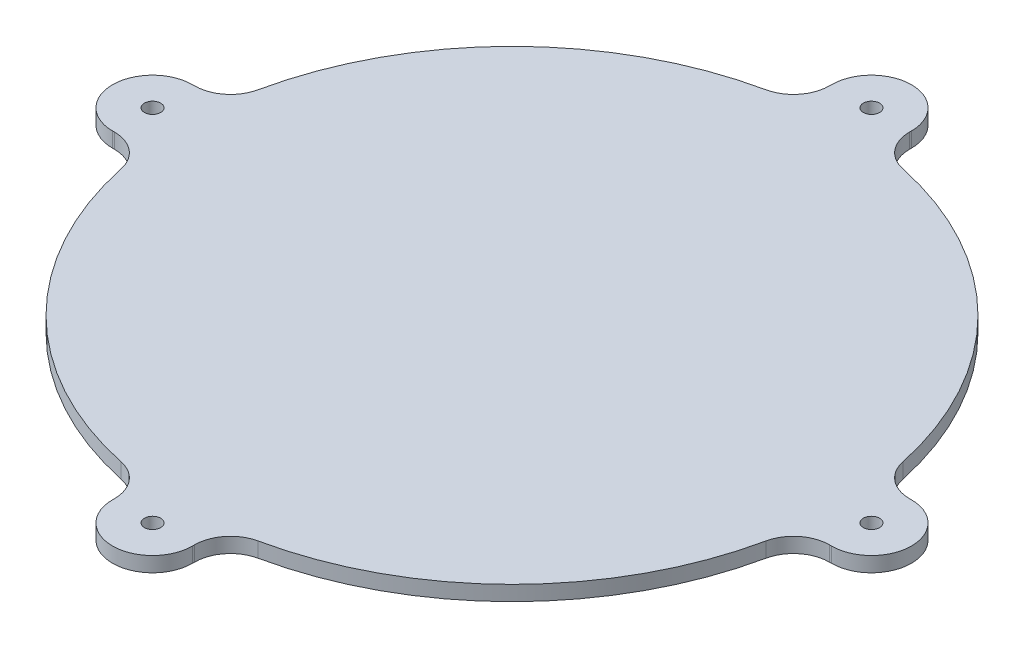
ISO-10303-21;
HEADER;
FILE_DESCRIPTION(('STEP AP214'),'2;1');
FILE_NAME('part.step','',(''),(''),'','','');
FILE_SCHEMA(('AUTOMOTIVE_DESIGN { 1 0 10303 214 1 1 1 1 }'));
ENDSEC;
DATA;
#1=APPLICATION_CONTEXT('core data for automotive mechanical design processes');
#2=APPLICATION_PROTOCOL_DEFINITION('international standard','automotive_design',2000,#1);
#3=PRODUCT_CONTEXT('',#1,'mechanical');
#4=PRODUCT('Part','Part','',(#3));
#5=PRODUCT_RELATED_PRODUCT_CATEGORY('part','',(#4));
#6=PRODUCT_DEFINITION_FORMATION('','',#4);
#7=PRODUCT_DEFINITION_CONTEXT('part definition',#1,'design');
#8=PRODUCT_DEFINITION('design','',#6,#7);
#9=PRODUCT_DEFINITION_SHAPE('','',#8);
#10=(LENGTH_UNIT() NAMED_UNIT(*) SI_UNIT(.MILLI.,.METRE.));
#11=(NAMED_UNIT(*) PLANE_ANGLE_UNIT() SI_UNIT($,.RADIAN.));
#12=(NAMED_UNIT(*) SI_UNIT($,.STERADIAN.) SOLID_ANGLE_UNIT());
#13=UNCERTAINTY_MEASURE_WITH_UNIT(LENGTH_MEASURE(1.E-05),#10,'distance_accuracy_value','');
#14=(GEOMETRIC_REPRESENTATION_CONTEXT(3) GLOBAL_UNCERTAINTY_ASSIGNED_CONTEXT((#13)) GLOBAL_UNIT_ASSIGNED_CONTEXT((#10,
#11,#12)) REPRESENTATION_CONTEXT('',''));
#15=CARTESIAN_POINT('',(0.,0.,0.));
#16=DIRECTION('',(0.,0.,1.));
#17=DIRECTION('',(1.,0.,0.));
#18=AXIS2_PLACEMENT_3D('',#15,#16,#17);
#19=CARTESIAN_POINT('',(-1.06390590781658E-11,3.175,-76.2));
#20=DIRECTION('',(0.,-1.,0.));
#21=DIRECTION('',(0.,0.,-1.));
#22=AXIS2_PLACEMENT_3D('',#19,#20,#21);
#23=PLANE('',#22);
#24=CARTESIAN_POINT('',(-1.06390590781658E-11,3.175,-76.2));
#25=DIRECTION('',(0.,1.,0.));
#26=DIRECTION('',(0.,0.,-1.));
#27=AXIS2_PLACEMENT_3D('',#24,#25,#26);
#28=CIRCLE('',#27,8.4836);
#29=CARTESIAN_POINT('',(8.48359999998936,3.175,-76.2));
#30=VERTEX_POINT('',#29);
#31=CARTESIAN_POINT('',(-8.48360000001064,3.175,-76.2));
#32=VERTEX_POINT('',#31);
#33=EDGE_CURVE('E218',#30,#32,#28,.T.);
#34=ORIENTED_EDGE('',*,*,#33,.T.);
#35=DIRECTION('',(0.,0.,1.));
#36=VECTOR('',#35,1.);
#37=CARTESIAN_POINT('',(-8.48360000001064,3.175,-76.2));
#38=LINE('',#37,#36);
#39=CARTESIAN_POINT('',(-8.48360000001064,3.175,-75.777799961728));
#40=VERTEX_POINT('',#39);
#41=EDGE_CURVE('E205',#32,#40,#38,.T.);
#42=ORIENTED_EDGE('',*,*,#41,.T.);
#43=CARTESIAN_POINT('',(-16.1036000000106,3.175,-75.777799961728));
#44=DIRECTION('',(0.,-1.,0.));
#45=DIRECTION('',(0.,0.,-1.));
#46=AXIS2_PLACEMENT_3D('',#43,#44,#45);
#47=CIRCLE('',#46,7.62);
#48=CARTESIAN_POINT('',(-14.5196393442719,3.175,-68.3242458671318));
#49=VERTEX_POINT('',#48);
#50=EDGE_CURVE('E299',#40,#49,#47,.T.);
#51=ORIENTED_EDGE('',*,*,#50,.T.);
#52=CARTESIAN_POINT('',(0.,3.175,0.));
#53=DIRECTION('',(0.,1.,0.));
#54=DIRECTION('',(0.,0.,1.));
#55=AXIS2_PLACEMENT_3D('',#52,#53,#54);
#56=CIRCLE('',#55,69.85);
#57=CARTESIAN_POINT('',(-68.3242458671358,3.175,-14.5196393442527));
#58=VERTEX_POINT('',#57);
#59=EDGE_CURVE('E217',#49,#58,#56,.T.);
#60=ORIENTED_EDGE('',*,*,#59,.T.);
#61=CARTESIAN_POINT('',(-75.7777999617325,3.175,-16.1035999999893));
#62=DIRECTION('',(0.,-1.,0.));
#63=DIRECTION('',(0.,0.,-1.));
#64=AXIS2_PLACEMENT_3D('',#61,#62,#63);
#65=CIRCLE('',#64,7.62);
#66=CARTESIAN_POINT('',(-75.7777999617325,3.175,-8.48359999998935));
#67=VERTEX_POINT('',#66);
#68=EDGE_CURVE('E335',#58,#67,#65,.T.);
#69=ORIENTED_EDGE('',*,*,#68,.T.);
#70=DIRECTION('',(-1.,0.,0.));
#71=VECTOR('',#70,1.);
#72=CARTESIAN_POINT('',(-76.2,3.175,-8.48359999998935));
#73=LINE('',#72,#71);
#74=CARTESIAN_POINT('',(-76.2,3.175,-8.48359999998935));
#75=VERTEX_POINT('',#74);
#76=EDGE_CURVE('E341',#67,#75,#73,.T.);
#77=ORIENTED_EDGE('',*,*,#76,.T.);
#78=CARTESIAN_POINT('',(-76.2,3.175,1.065305679108E-11));
#79=DIRECTION('',(0.,1.,0.));
#80=DIRECTION('',(0.,0.,-1.));
#81=AXIS2_PLACEMENT_3D('',#78,#79,#80);
#82=CIRCLE('',#81,8.4836);
#83=CARTESIAN_POINT('',(-76.2,3.175,8.48360000001065));
#84=VERTEX_POINT('',#83);
#85=EDGE_CURVE('E352',#75,#84,#82,.T.);
#86=ORIENTED_EDGE('',*,*,#85,.T.);
#87=DIRECTION('',(1.,0.,0.));
#88=VECTOR('',#87,1.);
#89=CARTESIAN_POINT('',(-76.2,3.175,8.48360000001065));
#90=LINE('',#89,#88);
#91=CARTESIAN_POINT('',(-75.777799961728,3.175,8.48360000001065));
#92=VERTEX_POINT('',#91);
#93=EDGE_CURVE('E436',#84,#92,#90,.T.);
#94=ORIENTED_EDGE('',*,*,#93,.T.);
#95=CARTESIAN_POINT('',(-75.777799961728,3.175,16.1036000000107));
#96=DIRECTION('',(0.,-1.,0.));
#97=DIRECTION('',(0.,0.,-1.));
#98=AXIS2_PLACEMENT_3D('',#95,#96,#97);
#99=CIRCLE('',#98,7.62);
#100=CARTESIAN_POINT('',(-68.3242458671318,3.175,14.5196393442719));
#101=VERTEX_POINT('',#100);
#102=EDGE_CURVE('E11',#92,#101,#99,.T.);
#103=ORIENTED_EDGE('',*,*,#102,.T.);
#104=CARTESIAN_POINT('',(0.,3.175,0.));
#105=DIRECTION('',(0.,1.,0.));
#106=DIRECTION('',(0.,0.,1.));
#107=AXIS2_PLACEMENT_3D('',#104,#105,#106);
#108=CIRCLE('',#107,69.85);
#109=CARTESIAN_POINT('',(-14.5196393442527,3.175,68.3242458671359));
#110=VERTEX_POINT('',#109);
#111=EDGE_CURVE('E442',#101,#110,#108,.T.);
#112=ORIENTED_EDGE('',*,*,#111,.T.);
#113=CARTESIAN_POINT('',(-16.1035999999893,3.175,75.7777999617325));
#114=DIRECTION('',(0.,-1.,0.));
#115=DIRECTION('',(0.,0.,-1.));
#116=AXIS2_PLACEMENT_3D('',#113,#114,#115);
#117=CIRCLE('',#116,7.62);
#118=CARTESIAN_POINT('',(-8.48359999998935,3.175,75.7777999617325));
#119=VERTEX_POINT('',#118);
#120=EDGE_CURVE('E329',#110,#119,#117,.T.);
#121=ORIENTED_EDGE('',*,*,#120,.T.);
#122=DIRECTION('',(0.,0.,1.));
#123=VECTOR('',#122,1.);
#124=CARTESIAN_POINT('',(-8.48359999998935,3.175,76.2));
#125=LINE('',#124,#123);
#126=CARTESIAN_POINT('',(-8.48359999998935,3.175,76.2));
#127=VERTEX_POINT('',#126);
#128=EDGE_CURVE('E449',#119,#127,#125,.T.);
#129=ORIENTED_EDGE('',*,*,#128,.T.);
#130=CARTESIAN_POINT('',(1.06483908867753E-11,3.175,76.2));
#131=DIRECTION('',(0.,1.,0.));
#132=DIRECTION('',(0.,0.,-1.));
#133=AXIS2_PLACEMENT_3D('',#130,#131,#132);
#134=CIRCLE('',#133,8.4836);
#135=CARTESIAN_POINT('',(8.48360000001065,3.175,76.2));
#136=VERTEX_POINT('',#135);
#137=EDGE_CURVE('E452',#127,#136,#134,.T.);
#138=ORIENTED_EDGE('',*,*,#137,.T.);
#139=DIRECTION('',(0.,0.,-1.));
#140=VECTOR('',#139,1.);
#141=CARTESIAN_POINT('',(8.48360000001065,3.175,76.2));
#142=LINE('',#141,#140);
#143=CARTESIAN_POINT('',(8.48360000001065,3.175,75.777799961728));
#144=VERTEX_POINT('',#143);
#145=EDGE_CURVE('E455',#136,#144,#142,.T.);
#146=ORIENTED_EDGE('',*,*,#145,.T.);
#147=CARTESIAN_POINT('',(16.1036000000106,3.175,75.777799961728));
#148=DIRECTION('',(0.,-1.,0.));
#149=DIRECTION('',(0.,0.,-1.));
#150=AXIS2_PLACEMENT_3D('',#147,#148,#149);
#151=CIRCLE('',#150,7.62);
#152=CARTESIAN_POINT('',(14.5196393442719,3.175,68.3242458671318));
#153=VERTEX_POINT('',#152);
#154=EDGE_CURVE('E323',#144,#153,#151,.T.);
#155=ORIENTED_EDGE('',*,*,#154,.T.);
#156=CARTESIAN_POINT('',(0.,3.175,0.));
#157=DIRECTION('',(0.,1.,0.));
#158=DIRECTION('',(0.,0.,1.));
#159=AXIS2_PLACEMENT_3D('',#156,#157,#158);
#160=CIRCLE('',#159,69.85);
#161=CARTESIAN_POINT('',(68.3242458671358,3.175,14.5196393442527));
#162=VERTEX_POINT('',#161);
#163=EDGE_CURVE('E459',#153,#162,#160,.T.);
#164=ORIENTED_EDGE('',*,*,#163,.T.);
#165=CARTESIAN_POINT('',(75.7777999617325,3.175,16.1035999999894));
#166=DIRECTION('',(0.,-1.,0.));
#167=DIRECTION('',(0.,0.,-1.));
#168=AXIS2_PLACEMENT_3D('',#165,#166,#167);
#169=CIRCLE('',#168,7.62);
#170=CARTESIAN_POINT('',(75.7777999617325,3.175,8.48359999998936));
#171=VERTEX_POINT('',#170);
#172=EDGE_CURVE('E317',#162,#171,#169,.T.);
#173=ORIENTED_EDGE('',*,*,#172,.T.);
#174=DIRECTION('',(1.,0.,0.));
#175=VECTOR('',#174,1.);
#176=CARTESIAN_POINT('',(76.2,3.175,8.48359999998936));
#177=LINE('',#176,#175);
#178=CARTESIAN_POINT('',(76.2,3.175,8.48359999998936));
#179=VERTEX_POINT('',#178);
#180=EDGE_CURVE('E463',#171,#179,#177,.T.);
#181=ORIENTED_EDGE('',*,*,#180,.T.);
#182=CARTESIAN_POINT('',(76.2,3.175,-1.06437249824705E-11));
#183=DIRECTION('',(0.,1.,0.));
#184=DIRECTION('',(0.,0.,-1.));
#185=AXIS2_PLACEMENT_3D('',#182,#183,#184);
#186=CIRCLE('',#185,8.4836);
#187=CARTESIAN_POINT('',(76.2,3.175,-8.48360000001064));
#188=VERTEX_POINT('',#187);
#189=EDGE_CURVE('E466',#179,#188,#186,.T.);
#190=ORIENTED_EDGE('',*,*,#189,.T.);
#191=DIRECTION('',(-1.,0.,0.));
#192=VECTOR('',#191,1.);
#193=CARTESIAN_POINT('',(76.2,3.175,-8.48360000001064));
#194=LINE('',#193,#192);
#195=CARTESIAN_POINT('',(75.777799961728,3.175,-8.48360000001064));
#196=VERTEX_POINT('',#195);
#197=EDGE_CURVE('E469',#188,#196,#194,.T.);
#198=ORIENTED_EDGE('',*,*,#197,.T.);
#199=CARTESIAN_POINT('',(75.777799961728,3.175,-16.1036000000106));
#200=DIRECTION('',(0.,-1.,0.));
#201=DIRECTION('',(0.,0.,-1.));
#202=AXIS2_PLACEMENT_3D('',#199,#200,#201);
#203=CIRCLE('',#202,7.62);
#204=CARTESIAN_POINT('',(68.3242458671318,3.175,-14.5196393442719));
#205=VERTEX_POINT('',#204);
#206=EDGE_CURVE('E311',#196,#205,#203,.T.);
#207=ORIENTED_EDGE('',*,*,#206,.T.);
#208=CARTESIAN_POINT('',(0.,3.175,0.));
#209=DIRECTION('',(0.,1.,0.));
#210=DIRECTION('',(0.,0.,1.));
#211=AXIS2_PLACEMENT_3D('',#208,#209,#210);
#212=CIRCLE('',#211,69.85);
#213=CARTESIAN_POINT('',(14.5196393442527,3.175,-68.3242458671358));
#214=VERTEX_POINT('',#213);
#215=EDGE_CURVE('E473',#205,#214,#212,.T.);
#216=ORIENTED_EDGE('',*,*,#215,.T.);
#217=CARTESIAN_POINT('',(16.1035999999894,3.175,-75.7777999617325));
#218=DIRECTION('',(0.,-1.,0.));
#219=DIRECTION('',(0.,0.,-1.));
#220=AXIS2_PLACEMENT_3D('',#217,#218,#219);
#221=CIRCLE('',#220,7.62);
#222=CARTESIAN_POINT('',(8.48359999998936,3.175,-75.7777999617325));
#223=VERTEX_POINT('',#222);
#224=EDGE_CURVE('E305',#214,#223,#221,.T.);
#225=ORIENTED_EDGE('',*,*,#224,.T.);
#226=DIRECTION('',(0.,0.,-1.));
#227=VECTOR('',#226,1.);
#228=CARTESIAN_POINT('',(8.48359999998936,3.175,-76.2));
#229=LINE('',#228,#227);
#230=EDGE_CURVE('E223',#223,#30,#229,.T.);
#231=ORIENTED_EDGE('',*,*,#230,.T.);
#232=EDGE_LOOP('',(#34,#42,#51,#60,#69,#77,#86,#94,#103,#112,#121,#129,#138,#146,#155,#164,#173,
#181,#190,#198,#207,#216,#225,#231));
#233=FACE_BOUND('',#232,.T.);
#234=CARTESIAN_POINT('',(-1.06390590781658E-11,3.175,-76.2));
#235=DIRECTION('',(0.,1.,0.));
#236=DIRECTION('',(0.,0.,1.));
#237=AXIS2_PLACEMENT_3D('',#234,#235,#236);
#238=CIRCLE('',#237,1.72720000001017);
#239=CARTESIAN_POINT('',(-1.06390590781658E-11,3.175,-74.4727999999898));
#240=VERTEX_POINT('',#239);
#241=EDGE_CURVE('E479',#240,#240,#238,.T.);
#242=ORIENTED_EDGE('',*,*,#241,.F.);
#243=EDGE_LOOP('',(#242));
#244=FACE_BOUND('',#243,.T.);
#245=CARTESIAN_POINT('',(76.1999999999915,3.175,-1.14130410228708E-12));
#246=DIRECTION('',(0.,1.,0.));
#247=DIRECTION('',(0.,0.,1.));
#248=AXIS2_PLACEMENT_3D('',#245,#246,#247);
#249=CIRCLE('',#248,1.72720000000382);
#250=CARTESIAN_POINT('',(76.1999999999915,3.175,1.72720000000268));
#251=VERTEX_POINT('',#250);
#252=EDGE_CURVE('E488',#251,#251,#249,.T.);
#253=ORIENTED_EDGE('',*,*,#252,.F.);
#254=EDGE_LOOP('',(#253));
#255=FACE_BOUND('',#254,.T.);
#256=CARTESIAN_POINT('',(-7.33882638442284E-12,3.175,76.200000000001));
#257=DIRECTION('',(0.,1.,0.));
#258=DIRECTION('',(0.,0.,1.));
#259=AXIS2_PLACEMENT_3D('',#256,#257,#258);
#260=CIRCLE('',#259,1.72719999999319);
#261=CARTESIAN_POINT('',(-7.33882638442284E-12,3.175,77.9271999999942));
#262=VERTEX_POINT('',#261);
#263=EDGE_CURVE('E496',#262,#262,#260,.T.);
#264=ORIENTED_EDGE('',*,*,#263,.F.);
#265=EDGE_LOOP('',(#264));
#266=FACE_BOUND('',#265,.T.);
#267=CARTESIAN_POINT('',(-76.2000000000095,3.175,2.17759220867485E-12));
#268=DIRECTION('',(0.,1.,0.));
#269=DIRECTION('',(0.,0.,1.));
#270=AXIS2_PLACEMENT_3D('',#267,#268,#269);
#271=CIRCLE('',#270,1.72720000000007);
#272=CARTESIAN_POINT('',(-76.2000000000095,3.175,1.72720000000225));
#273=VERTEX_POINT('',#272);
#274=EDGE_CURVE('E504',#273,#273,#271,.T.);
#275=ORIENTED_EDGE('',*,*,#274,.F.);
#276=EDGE_LOOP('',(#275));
#277=FACE_BOUND('',#276,.T.);
#278=ADVANCED_FACE('F43',(#233,#244,#255,#266,#277),#23,.F.);
#279=CARTESIAN_POINT('',(-1.06390590781658E-11,0.,-76.2));
#280=DIRECTION('',(0.,-1.,0.));
#281=DIRECTION('',(0.,0.,-1.));
#282=AXIS2_PLACEMENT_3D('',#279,#280,#281);
#283=PLANE('',#282);
#284=CARTESIAN_POINT('',(-7.33882638442284E-12,0.,76.200000000001));
#285=DIRECTION('',(0.,1.,0.));
#286=DIRECTION('',(0.,0.,1.));
#287=AXIS2_PLACEMENT_3D('',#284,#285,#286);
#288=CIRCLE('',#287,1.72719999999319);
#289=CARTESIAN_POINT('',(-7.33882638442284E-12,0.,77.9271999999942));
#290=VERTEX_POINT('',#289);
#291=EDGE_CURVE('E500',#290,#290,#288,.T.);
#292=ORIENTED_EDGE('',*,*,#291,.T.);
#293=EDGE_LOOP('',(#292));
#294=FACE_BOUND('',#293,.T.);
#295=CARTESIAN_POINT('',(-1.06390590781658E-11,0.,-76.2));
#296=DIRECTION('',(0.,1.,0.));
#297=DIRECTION('',(0.,0.,1.));
#298=AXIS2_PLACEMENT_3D('',#295,#296,#297);
#299=CIRCLE('',#298,1.72720000001017);
#300=CARTESIAN_POINT('',(-1.06390590781658E-11,0.,-74.4727999999898));
#301=VERTEX_POINT('',#300);
#302=EDGE_CURVE('E482',#301,#301,#299,.T.);
#303=ORIENTED_EDGE('',*,*,#302,.T.);
#304=EDGE_LOOP('',(#303));
#305=FACE_BOUND('',#304,.T.);
#306=CARTESIAN_POINT('',(-1.06390590781658E-11,0.,-76.2));
#307=DIRECTION('',(0.,1.,0.));
#308=DIRECTION('',(0.,0.,-1.));
#309=AXIS2_PLACEMENT_3D('',#306,#307,#308);
#310=CIRCLE('',#309,8.4836);
#311=CARTESIAN_POINT('',(8.48359999998936,0.,-76.2));
#312=VERTEX_POINT('',#311);
#313=CARTESIAN_POINT('',(-8.48360000001064,0.,-76.2));
#314=VERTEX_POINT('',#313);
#315=EDGE_CURVE('E232',#312,#314,#310,.T.);
#316=ORIENTED_EDGE('',*,*,#315,.F.);
#317=DIRECTION('',(0.,0.,-1.));
#318=VECTOR('',#317,1.);
#319=CARTESIAN_POINT('',(8.48359999998936,0.,-76.2));
#320=LINE('',#319,#318);
#321=CARTESIAN_POINT('',(8.48359999998936,0.,-75.7777999617325));
#322=VERTEX_POINT('',#321);
#323=EDGE_CURVE('E228',#322,#312,#320,.T.);
#324=ORIENTED_EDGE('',*,*,#323,.F.);
#325=CARTESIAN_POINT('',(16.1035999999894,0.,-75.7777999617325));
#326=DIRECTION('',(0.,-1.,0.));
#327=DIRECTION('',(0.,0.,-1.));
#328=AXIS2_PLACEMENT_3D('',#325,#326,#327);
#329=CIRCLE('',#328,7.62);
#330=CARTESIAN_POINT('',(14.5196393442527,0.,-68.3242458671358));
#331=VERTEX_POINT('',#330);
#332=EDGE_CURVE('E302',#322,#331,#329,.F.);
#333=ORIENTED_EDGE('',*,*,#332,.T.);
#334=CARTESIAN_POINT('',(0.,0.,0.));
#335=DIRECTION('',(0.,1.,0.));
#336=DIRECTION('',(0.,0.,1.));
#337=AXIS2_PLACEMENT_3D('',#334,#335,#336);
#338=CIRCLE('',#337,69.85);
#339=CARTESIAN_POINT('',(68.3242458671318,0.,-14.5196393442719));
#340=VERTEX_POINT('',#339);
#341=EDGE_CURVE('E408',#340,#331,#338,.T.);
#342=ORIENTED_EDGE('',*,*,#341,.F.);
#343=CARTESIAN_POINT('',(75.777799961728,0.,-16.1036000000106));
#344=DIRECTION('',(0.,-1.,0.));
#345=DIRECTION('',(0.,0.,-1.));
#346=AXIS2_PLACEMENT_3D('',#343,#344,#345);
#347=CIRCLE('',#346,7.62);
#348=CARTESIAN_POINT('',(75.777799961728,0.,-8.48360000001064));
#349=VERTEX_POINT('',#348);
#350=EDGE_CURVE('E308',#340,#349,#347,.F.);
#351=ORIENTED_EDGE('',*,*,#350,.T.);
#352=DIRECTION('',(-1.,0.,0.));
#353=VECTOR('',#352,1.);
#354=CARTESIAN_POINT('',(76.2,0.,-8.48360000001064));
#355=LINE('',#354,#353);
#356=CARTESIAN_POINT('',(76.2,0.,-8.48360000001064));
#357=VERTEX_POINT('',#356);
#358=EDGE_CURVE('E404',#357,#349,#355,.T.);
#359=ORIENTED_EDGE('',*,*,#358,.F.);
#360=CARTESIAN_POINT('',(76.2,0.,-1.06437249824705E-11));
#361=DIRECTION('',(0.,1.,0.));
#362=DIRECTION('',(0.,0.,-1.));
#363=AXIS2_PLACEMENT_3D('',#360,#361,#362);
#364=CIRCLE('',#363,8.4836);
#365=CARTESIAN_POINT('',(76.2,0.,8.48359999998936));
#366=VERTEX_POINT('',#365);
#367=EDGE_CURVE('E401',#366,#357,#364,.T.);
#368=ORIENTED_EDGE('',*,*,#367,.F.);
#369=DIRECTION('',(1.,0.,0.));
#370=VECTOR('',#369,1.);
#371=CARTESIAN_POINT('',(76.2,0.,8.48359999998936));
#372=LINE('',#371,#370);
#373=CARTESIAN_POINT('',(75.7777999617325,0.,8.48359999998936));
#374=VERTEX_POINT('',#373);
#375=EDGE_CURVE('E398',#374,#366,#372,.T.);
#376=ORIENTED_EDGE('',*,*,#375,.F.);
#377=CARTESIAN_POINT('',(75.7777999617325,0.,16.1035999999894));
#378=DIRECTION('',(0.,-1.,0.));
#379=DIRECTION('',(0.,0.,-1.));
#380=AXIS2_PLACEMENT_3D('',#377,#378,#379);
#381=CIRCLE('',#380,7.62);
#382=CARTESIAN_POINT('',(68.3242458671358,0.,14.5196393442527));
#383=VERTEX_POINT('',#382);
#384=EDGE_CURVE('E314',#374,#383,#381,.F.);
#385=ORIENTED_EDGE('',*,*,#384,.T.);
#386=CARTESIAN_POINT('',(0.,0.,0.));
#387=DIRECTION('',(0.,1.,0.));
#388=DIRECTION('',(0.,0.,1.));
#389=AXIS2_PLACEMENT_3D('',#386,#387,#388);
#390=CIRCLE('',#389,69.85);
#391=CARTESIAN_POINT('',(14.5196393442719,0.,68.3242458671318));
#392=VERTEX_POINT('',#391);
#393=EDGE_CURVE('E394',#392,#383,#390,.T.);
#394=ORIENTED_EDGE('',*,*,#393,.F.);
#395=CARTESIAN_POINT('',(16.1036000000106,0.,75.777799961728));
#396=DIRECTION('',(0.,-1.,0.));
#397=DIRECTION('',(0.,0.,-1.));
#398=AXIS2_PLACEMENT_3D('',#395,#396,#397);
#399=CIRCLE('',#398,7.62);
#400=CARTESIAN_POINT('',(8.48360000001065,0.,75.777799961728));
#401=VERTEX_POINT('',#400);
#402=EDGE_CURVE('E320',#392,#401,#399,.F.);
#403=ORIENTED_EDGE('',*,*,#402,.T.);
#404=DIRECTION('',(0.,0.,-1.));
#405=VECTOR('',#404,1.);
#406=CARTESIAN_POINT('',(8.48360000001065,0.,76.2));
#407=LINE('',#406,#405);
#408=CARTESIAN_POINT('',(8.48360000001065,0.,76.2));
#409=VERTEX_POINT('',#408);
#410=EDGE_CURVE('E390',#409,#401,#407,.T.);
#411=ORIENTED_EDGE('',*,*,#410,.F.);
#412=CARTESIAN_POINT('',(1.06483908867753E-11,0.,76.2));
#413=DIRECTION('',(0.,1.,0.));
#414=DIRECTION('',(0.,0.,-1.));
#415=AXIS2_PLACEMENT_3D('',#412,#413,#414);
#416=CIRCLE('',#415,8.4836);
#417=CARTESIAN_POINT('',(-8.48359999998935,0.,76.2));
#418=VERTEX_POINT('',#417);
#419=EDGE_CURVE('E387',#418,#409,#416,.T.);
#420=ORIENTED_EDGE('',*,*,#419,.F.);
#421=DIRECTION('',(0.,0.,1.));
#422=VECTOR('',#421,1.);
#423=CARTESIAN_POINT('',(-8.48359999998935,0.,76.2));
#424=LINE('',#423,#422);
#425=CARTESIAN_POINT('',(-8.48359999998935,0.,75.7777999617325));
#426=VERTEX_POINT('',#425);
#427=EDGE_CURVE('E384',#426,#418,#424,.T.);
#428=ORIENTED_EDGE('',*,*,#427,.F.);
#429=CARTESIAN_POINT('',(-16.1035999999893,0.,75.7777999617325));
#430=DIRECTION('',(0.,-1.,0.));
#431=DIRECTION('',(0.,0.,-1.));
#432=AXIS2_PLACEMENT_3D('',#429,#430,#431);
#433=CIRCLE('',#432,7.62);
#434=CARTESIAN_POINT('',(-14.5196393442527,0.,68.3242458671359));
#435=VERTEX_POINT('',#434);
#436=EDGE_CURVE('E326',#426,#435,#433,.F.);
#437=ORIENTED_EDGE('',*,*,#436,.T.);
#438=CARTESIAN_POINT('',(0.,0.,0.));
#439=DIRECTION('',(0.,1.,0.));
#440=DIRECTION('',(0.,0.,1.));
#441=AXIS2_PLACEMENT_3D('',#438,#439,#440);
#442=CIRCLE('',#441,69.85);
#443=CARTESIAN_POINT('',(-68.3242458671318,0.,14.5196393442719));
#444=VERTEX_POINT('',#443);
#445=EDGE_CURVE('E380',#444,#435,#442,.T.);
#446=ORIENTED_EDGE('',*,*,#445,.F.);
#447=CARTESIAN_POINT('',(-75.777799961728,0.,16.1036000000107));
#448=DIRECTION('',(0.,-1.,0.));
#449=DIRECTION('',(0.,0.,-1.));
#450=AXIS2_PLACEMENT_3D('',#447,#448,#449);
#451=CIRCLE('',#450,7.62);
#452=CARTESIAN_POINT('',(-75.777799961728,0.,8.48360000001065));
#453=VERTEX_POINT('',#452);
#454=EDGE_CURVE('E52',#444,#453,#451,.F.);
#455=ORIENTED_EDGE('',*,*,#454,.T.);
#456=DIRECTION('',(1.,0.,0.));
#457=VECTOR('',#456,1.);
#458=CARTESIAN_POINT('',(-76.2,0.,8.48360000001065));
#459=LINE('',#458,#457);
#460=CARTESIAN_POINT('',(-76.2,0.,8.48360000001065));
#461=VERTEX_POINT('',#460);
#462=EDGE_CURVE('E377',#461,#453,#459,.T.);
#463=ORIENTED_EDGE('',*,*,#462,.F.);
#464=CARTESIAN_POINT('',(-76.2,0.,1.065305679108E-11));
#465=DIRECTION('',(0.,1.,0.));
#466=DIRECTION('',(0.,0.,-1.));
#467=AXIS2_PLACEMENT_3D('',#464,#465,#466);
#468=CIRCLE('',#467,8.4836);
#469=CARTESIAN_POINT('',(-76.2,0.,-8.48359999998935));
#470=VERTEX_POINT('',#469);
#471=EDGE_CURVE('E370',#470,#461,#468,.T.);
#472=ORIENTED_EDGE('',*,*,#471,.F.);
#473=DIRECTION('',(-1.,0.,0.));
#474=VECTOR('',#473,1.);
#475=CARTESIAN_POINT('',(-76.2,0.,-8.48359999998935));
#476=LINE('',#475,#474);
#477=CARTESIAN_POINT('',(-75.7777999617325,0.,-8.48359999998935));
#478=VERTEX_POINT('',#477);
#479=EDGE_CURVE('E361',#478,#470,#476,.T.);
#480=ORIENTED_EDGE('',*,*,#479,.F.);
#481=CARTESIAN_POINT('',(-75.7777999617325,0.,-16.1035999999893));
#482=DIRECTION('',(0.,-1.,0.));
#483=DIRECTION('',(0.,0.,-1.));
#484=AXIS2_PLACEMENT_3D('',#481,#482,#483);
#485=CIRCLE('',#484,7.62);
#486=CARTESIAN_POINT('',(-68.3242458671358,0.,-14.5196393442527));
#487=VERTEX_POINT('',#486);
#488=EDGE_CURVE('E332',#478,#487,#485,.F.);
#489=ORIENTED_EDGE('',*,*,#488,.T.);
#490=CARTESIAN_POINT('',(0.,0.,0.));
#491=DIRECTION('',(0.,1.,0.));
#492=DIRECTION('',(0.,0.,1.));
#493=AXIS2_PLACEMENT_3D('',#490,#491,#492);
#494=CIRCLE('',#493,69.85);
#495=CARTESIAN_POINT('',(-14.5196393442719,0.,-68.3242458671318));
#496=VERTEX_POINT('',#495);
#497=EDGE_CURVE('E359',#496,#487,#494,.T.);
#498=ORIENTED_EDGE('',*,*,#497,.F.);
#499=CARTESIAN_POINT('',(-16.1036000000106,0.,-75.777799961728));
#500=DIRECTION('',(0.,-1.,0.));
#501=DIRECTION('',(0.,0.,-1.));
#502=AXIS2_PLACEMENT_3D('',#499,#500,#501);
#503=CIRCLE('',#502,7.62);
#504=CARTESIAN_POINT('',(-8.48360000001064,0.,-75.777799961728));
#505=VERTEX_POINT('',#504);
#506=EDGE_CURVE('E296',#496,#505,#503,.F.);
#507=ORIENTED_EDGE('',*,*,#506,.T.);
#508=DIRECTION('',(0.,0.,1.));
#509=VECTOR('',#508,1.);
#510=CARTESIAN_POINT('',(-8.48360000001064,0.,-76.2));
#511=LINE('',#510,#509);
#512=EDGE_CURVE('E366',#314,#505,#511,.T.);
#513=ORIENTED_EDGE('',*,*,#512,.F.);
#514=EDGE_LOOP('',(#316,#324,#333,#342,#351,#359,#368,#376,#385,#394,#403,#411,#420,#428,#437,
#446,#455,#463,#472,#480,#489,#498,#507,#513));
#515=FACE_BOUND('',#514,.T.);
#516=CARTESIAN_POINT('',(76.1999999999915,0.,-1.14130410228708E-12));
#517=DIRECTION('',(0.,1.,0.));
#518=DIRECTION('',(0.,0.,1.));
#519=AXIS2_PLACEMENT_3D('',#516,#517,#518);
#520=CIRCLE('',#519,1.72720000000382);
#521=CARTESIAN_POINT('',(76.1999999999915,0.,1.72720000000268));
#522=VERTEX_POINT('',#521);
#523=EDGE_CURVE('E491',#522,#522,#520,.T.);
#524=ORIENTED_EDGE('',*,*,#523,.T.);
#525=EDGE_LOOP('',(#524));
#526=FACE_BOUND('',#525,.T.);
#527=CARTESIAN_POINT('',(-76.2000000000095,0.,2.17759220867485E-12));
#528=DIRECTION('',(0.,1.,0.));
#529=DIRECTION('',(0.,0.,1.));
#530=AXIS2_PLACEMENT_3D('',#527,#528,#529);
#531=CIRCLE('',#530,1.72720000000007);
#532=CARTESIAN_POINT('',(-76.2000000000095,0.,1.72720000000225));
#533=VERTEX_POINT('',#532);
#534=EDGE_CURVE('E508',#533,#533,#531,.T.);
#535=ORIENTED_EDGE('',*,*,#534,.T.);
#536=EDGE_LOOP('',(#535));
#537=FACE_BOUND('',#536,.T.);
#538=ADVANCED_FACE('F357',(#294,#305,#515,#526,#537),#283,.T.);
#539=CARTESIAN_POINT('',(-1.06390590781658E-11,3.175,-76.2));
#540=DIRECTION('',(0.,-1.,0.));
#541=DIRECTION('',(0.,0.,-1.));
#542=AXIS2_PLACEMENT_3D('',#539,#540,#541);
#543=CYLINDRICAL_SURFACE('',#542,8.4836);
#544=ORIENTED_EDGE('',*,*,#315,.T.);
#545=DIRECTION('',(0.,-1.,0.));
#546=VECTOR('',#545,1.);
#547=CARTESIAN_POINT('',(-8.48360000001064,3.175,-76.2));
#548=LINE('',#547,#546);
#549=EDGE_CURVE('E210',#32,#314,#548,.T.);
#550=ORIENTED_EDGE('',*,*,#549,.F.);
#551=ORIENTED_EDGE('',*,*,#33,.F.);
#552=DIRECTION('',(0.,-1.,0.));
#553=VECTOR('',#552,1.);
#554=CARTESIAN_POINT('',(8.48359999998936,3.175,-76.2));
#555=LINE('',#554,#553);
#556=EDGE_CURVE('E414',#30,#312,#555,.T.);
#557=ORIENTED_EDGE('',*,*,#556,.T.);
#558=EDGE_LOOP('',(#544,#550,#551,#557));
#559=FACE_BOUND('',#558,.T.);
#560=ADVANCED_FACE('F230',(#559),#543,.T.);
#561=CARTESIAN_POINT('',(-8.48360000001064,3.175,-76.2));
#562=DIRECTION('',(1.,0.,0.));
#563=DIRECTION('',(0.,0.,-1.));
#564=AXIS2_PLACEMENT_3D('',#561,#562,#563);
#565=PLANE('',#564);
#566=ORIENTED_EDGE('',*,*,#512,.T.);
#567=DIRECTION('',(0.,1.,0.));
#568=VECTOR('',#567,1.);
#569=CARTESIAN_POINT('',(-8.48360000001064,3.175,-75.777799961728));
#570=LINE('',#569,#568);
#571=EDGE_CURVE('E213',#505,#40,#570,.T.);
#572=ORIENTED_EDGE('',*,*,#571,.T.);
#573=ORIENTED_EDGE('',*,*,#41,.F.);
#574=ORIENTED_EDGE('',*,*,#549,.T.);
#575=EDGE_LOOP('',(#566,#572,#573,#574));
#576=FACE_BOUND('',#575,.T.);
#577=ADVANCED_FACE('F208',(#576),#565,.F.);
#578=CARTESIAN_POINT('',(0.,3.175,0.));
#579=DIRECTION('',(0.,-1.,0.));
#580=DIRECTION('',(0.,0.,-1.));
#581=AXIS2_PLACEMENT_3D('',#578,#579,#580);
#582=CYLINDRICAL_SURFACE('',#581,69.85);
#583=ORIENTED_EDGE('',*,*,#59,.F.);
#584=DIRECTION('',(0.,-1.,0.));
#585=VECTOR('',#584,1.);
#586=CARTESIAN_POINT('',(-14.5196393442719,3.175,-68.3242458671318));
#587=LINE('',#586,#585);
#588=EDGE_CURVE('E239',#49,#496,#587,.T.);
#589=ORIENTED_EDGE('',*,*,#588,.T.);
#590=ORIENTED_EDGE('',*,*,#497,.T.);
#591=DIRECTION('',(0.,-1.,0.));
#592=VECTOR('',#591,1.);
#593=CARTESIAN_POINT('',(-68.3242458671358,3.175,-14.5196393442527));
#594=LINE('',#593,#592);
#595=EDGE_CURVE('E234',#487,#58,#594,.F.);
#596=ORIENTED_EDGE('',*,*,#595,.T.);
#597=EDGE_LOOP('',(#583,#589,#590,#596));
#598=FACE_BOUND('',#597,.T.);
#599=ADVANCED_FACE('F363',(#598),#582,.T.);
#600=CARTESIAN_POINT('',(-76.2,3.175,-8.48359999998935));
#601=DIRECTION('',(0.,0.,1.));
#602=DIRECTION('',(1.,0.,0.));
#603=AXIS2_PLACEMENT_3D('',#600,#601,#602);
#604=PLANE('',#603);
#605=ORIENTED_EDGE('',*,*,#76,.F.);
#606=DIRECTION('',(0.,1.,0.));
#607=VECTOR('',#606,1.);
#608=CARTESIAN_POINT('',(-75.7777999617325,0.,-8.48359999998935));
#609=LINE('',#608,#607);
#610=EDGE_CURVE('E290',#67,#478,#609,.F.);
#611=ORIENTED_EDGE('',*,*,#610,.T.);
#612=ORIENTED_EDGE('',*,*,#479,.T.);
#613=DIRECTION('',(0.,-1.,0.));
#614=VECTOR('',#613,1.);
#615=CARTESIAN_POINT('',(-76.2,3.175,-8.48359999998935));
#616=LINE('',#615,#614);
#617=EDGE_CURVE('E235',#75,#470,#616,.T.);
#618=ORIENTED_EDGE('',*,*,#617,.F.);
#619=EDGE_LOOP('',(#605,#611,#612,#618));
#620=FACE_BOUND('',#619,.T.);
#621=ADVANCED_FACE('F348',(#620),#604,.F.);
#622=CARTESIAN_POINT('',(-76.2,3.175,1.065305679108E-11));
#623=DIRECTION('',(0.,-1.,0.));
#624=DIRECTION('',(0.,0.,-1.));
#625=AXIS2_PLACEMENT_3D('',#622,#623,#624);
#626=CYLINDRICAL_SURFACE('',#625,8.4836);
#627=ORIENTED_EDGE('',*,*,#471,.T.);
#628=DIRECTION('',(0.,-1.,0.));
#629=VECTOR('',#628,1.);
#630=CARTESIAN_POINT('',(-76.2,3.175,8.48360000001065));
#631=LINE('',#630,#629);
#632=EDGE_CURVE('E242',#84,#461,#631,.T.);
#633=ORIENTED_EDGE('',*,*,#632,.F.);
#634=ORIENTED_EDGE('',*,*,#85,.F.);
#635=ORIENTED_EDGE('',*,*,#617,.T.);
#636=EDGE_LOOP('',(#627,#633,#634,#635));
#637=FACE_BOUND('',#636,.T.);
#638=ADVANCED_FACE('F438',(#637),#626,.T.);
#639=CARTESIAN_POINT('',(-76.2,3.175,8.48360000001065));
#640=DIRECTION('',(0.,0.,-1.));
#641=DIRECTION('',(-1.,0.,0.));
#642=AXIS2_PLACEMENT_3D('',#639,#640,#641);
#643=PLANE('',#642);
#644=ORIENTED_EDGE('',*,*,#462,.T.);
#645=DIRECTION('',(0.,1.,0.));
#646=VECTOR('',#645,1.);
#647=CARTESIAN_POINT('',(-75.777799961728,3.175,8.48360000001065));
#648=LINE('',#647,#646);
#649=EDGE_CURVE('E59',#453,#92,#648,.T.);
#650=ORIENTED_EDGE('',*,*,#649,.T.);
#651=ORIENTED_EDGE('',*,*,#93,.F.);
#652=ORIENTED_EDGE('',*,*,#632,.T.);
#653=EDGE_LOOP('',(#644,#650,#651,#652));
#654=FACE_BOUND('',#653,.T.);
#655=ADVANCED_FACE('F435',(#654),#643,.F.);
#656=CARTESIAN_POINT('',(0.,3.175,0.));
#657=DIRECTION('',(0.,-1.,0.));
#658=DIRECTION('',(0.,0.,-1.));
#659=AXIS2_PLACEMENT_3D('',#656,#657,#658);
#660=CYLINDRICAL_SURFACE('',#659,69.85);
#661=ORIENTED_EDGE('',*,*,#445,.T.);
#662=DIRECTION('',(0.,-1.,0.));
#663=VECTOR('',#662,1.);
#664=CARTESIAN_POINT('',(-14.5196393442527,3.175,68.3242458671359));
#665=LINE('',#664,#663);
#666=EDGE_CURVE('E287',#435,#110,#665,.F.);
#667=ORIENTED_EDGE('',*,*,#666,.T.);
#668=ORIENTED_EDGE('',*,*,#111,.F.);
#669=DIRECTION('',(0.,-1.,0.));
#670=VECTOR('',#669,1.);
#671=CARTESIAN_POINT('',(-68.3242458671318,3.175,14.5196393442719));
#672=LINE('',#671,#670);
#673=EDGE_CURVE('E283',#101,#444,#672,.T.);
#674=ORIENTED_EDGE('',*,*,#673,.T.);
#675=EDGE_LOOP('',(#661,#667,#668,#674));
#676=FACE_BOUND('',#675,.T.);
#677=ADVANCED_FACE('F565',(#676),#660,.T.);
#678=CARTESIAN_POINT('',(-8.48359999998935,3.175,76.2));
#679=DIRECTION('',(1.,0.,0.));
#680=DIRECTION('',(0.,0.,-1.));
#681=AXIS2_PLACEMENT_3D('',#678,#679,#680);
#682=PLANE('',#681);
#683=ORIENTED_EDGE('',*,*,#128,.F.);
#684=DIRECTION('',(0.,1.,0.));
#685=VECTOR('',#684,1.);
#686=CARTESIAN_POINT('',(-8.48359999998935,0.,75.7777999617325));
#687=LINE('',#686,#685);
#688=EDGE_CURVE('E279',#119,#426,#687,.F.);
#689=ORIENTED_EDGE('',*,*,#688,.T.);
#690=ORIENTED_EDGE('',*,*,#427,.T.);
#691=DIRECTION('',(0.,-1.,0.));
#692=VECTOR('',#691,1.);
#693=CARTESIAN_POINT('',(-8.48359999998935,3.175,76.2));
#694=LINE('',#693,#692);
#695=EDGE_CURVE('E429',#127,#418,#694,.T.);
#696=ORIENTED_EDGE('',*,*,#695,.F.);
#697=EDGE_LOOP('',(#683,#689,#690,#696));
#698=FACE_BOUND('',#697,.T.);
#699=ADVANCED_FACE('F561',(#698),#682,.F.);
#700=CARTESIAN_POINT('',(1.06483908867753E-11,3.175,76.2));
#701=DIRECTION('',(0.,-1.,0.));
#702=DIRECTION('',(0.,0.,-1.));
#703=AXIS2_PLACEMENT_3D('',#700,#701,#702);
#704=CYLINDRICAL_SURFACE('',#703,8.4836);
#705=ORIENTED_EDGE('',*,*,#419,.T.);
#706=DIRECTION('',(0.,-1.,0.));
#707=VECTOR('',#706,1.);
#708=CARTESIAN_POINT('',(8.48360000001065,3.175,76.2));
#709=LINE('',#708,#707);
#710=EDGE_CURVE('E425',#136,#409,#709,.T.);
#711=ORIENTED_EDGE('',*,*,#710,.F.);
#712=ORIENTED_EDGE('',*,*,#137,.F.);
#713=ORIENTED_EDGE('',*,*,#695,.T.);
#714=EDGE_LOOP('',(#705,#711,#712,#713));
#715=FACE_BOUND('',#714,.T.);
#716=ADVANCED_FACE('F557',(#715),#704,.T.);
#717=CARTESIAN_POINT('',(8.48360000001065,3.175,76.2));
#718=DIRECTION('',(-1.,0.,0.));
#719=DIRECTION('',(0.,0.,1.));
#720=AXIS2_PLACEMENT_3D('',#717,#718,#719);
#721=PLANE('',#720);
#722=ORIENTED_EDGE('',*,*,#410,.T.);
#723=DIRECTION('',(0.,1.,0.));
#724=VECTOR('',#723,1.);
#725=CARTESIAN_POINT('',(8.48360000001065,3.175,75.777799961728));
#726=LINE('',#725,#724);
#727=EDGE_CURVE('E276',#401,#144,#726,.T.);
#728=ORIENTED_EDGE('',*,*,#727,.T.);
#729=ORIENTED_EDGE('',*,*,#145,.F.);
#730=ORIENTED_EDGE('',*,*,#710,.T.);
#731=EDGE_LOOP('',(#722,#728,#729,#730));
#732=FACE_BOUND('',#731,.T.);
#733=ADVANCED_FACE('F553',(#732),#721,.F.);
#734=CARTESIAN_POINT('',(0.,3.175,0.));
#735=DIRECTION('',(0.,-1.,0.));
#736=DIRECTION('',(0.,0.,-1.));
#737=AXIS2_PLACEMENT_3D('',#734,#735,#736);
#738=CYLINDRICAL_SURFACE('',#737,69.85);
#739=ORIENTED_EDGE('',*,*,#393,.T.);
#740=DIRECTION('',(0.,-1.,0.));
#741=VECTOR('',#740,1.);
#742=CARTESIAN_POINT('',(68.3242458671358,3.175,14.5196393442527));
#743=LINE('',#742,#741);
#744=EDGE_CURVE('E273',#383,#162,#743,.F.);
#745=ORIENTED_EDGE('',*,*,#744,.T.);
#746=ORIENTED_EDGE('',*,*,#163,.F.);
#747=DIRECTION('',(0.,-1.,0.));
#748=VECTOR('',#747,1.);
#749=CARTESIAN_POINT('',(14.5196393442719,3.175,68.3242458671318));
#750=LINE('',#749,#748);
#751=EDGE_CURVE('E269',#153,#392,#750,.T.);
#752=ORIENTED_EDGE('',*,*,#751,.T.);
#753=EDGE_LOOP('',(#739,#745,#746,#752));
#754=FACE_BOUND('',#753,.T.);
#755=ADVANCED_FACE('F549',(#754),#738,.T.);
#756=CARTESIAN_POINT('',(76.2,3.175,8.48359999998936));
#757=DIRECTION('',(0.,0.,-1.));
#758=DIRECTION('',(-1.,0.,0.));
#759=AXIS2_PLACEMENT_3D('',#756,#757,#758);
#760=PLANE('',#759);
#761=ORIENTED_EDGE('',*,*,#180,.F.);
#762=DIRECTION('',(0.,1.,0.));
#763=VECTOR('',#762,1.);
#764=CARTESIAN_POINT('',(75.7777999617325,0.,8.48359999998936));
#765=LINE('',#764,#763);
#766=EDGE_CURVE('E265',#171,#374,#765,.F.);
#767=ORIENTED_EDGE('',*,*,#766,.T.);
#768=ORIENTED_EDGE('',*,*,#375,.T.);
#769=DIRECTION('',(0.,-1.,0.));
#770=VECTOR('',#769,1.);
#771=CARTESIAN_POINT('',(76.2,3.175,8.48359999998936));
#772=LINE('',#771,#770);
#773=EDGE_CURVE('E421',#179,#366,#772,.T.);
#774=ORIENTED_EDGE('',*,*,#773,.F.);
#775=EDGE_LOOP('',(#761,#767,#768,#774));
#776=FACE_BOUND('',#775,.T.);
#777=ADVANCED_FACE('F545',(#776),#760,.F.);
#778=CARTESIAN_POINT('',(76.2,3.175,-1.06437249824705E-11));
#779=DIRECTION('',(0.,-1.,0.));
#780=DIRECTION('',(0.,0.,-1.));
#781=AXIS2_PLACEMENT_3D('',#778,#779,#780);
#782=CYLINDRICAL_SURFACE('',#781,8.4836);
#783=ORIENTED_EDGE('',*,*,#367,.T.);
#784=DIRECTION('',(0.,-1.,0.));
#785=VECTOR('',#784,1.);
#786=CARTESIAN_POINT('',(76.2,3.175,-8.48360000001064));
#787=LINE('',#786,#785);
#788=EDGE_CURVE('E417',#188,#357,#787,.T.);
#789=ORIENTED_EDGE('',*,*,#788,.F.);
#790=ORIENTED_EDGE('',*,*,#189,.F.);
#791=ORIENTED_EDGE('',*,*,#773,.T.);
#792=EDGE_LOOP('',(#783,#789,#790,#791));
#793=FACE_BOUND('',#792,.T.);
#794=ADVANCED_FACE('F541',(#793),#782,.T.);
#795=CARTESIAN_POINT('',(76.2,3.175,-8.48360000001064));
#796=DIRECTION('',(0.,0.,1.));
#797=DIRECTION('',(1.,0.,0.));
#798=AXIS2_PLACEMENT_3D('',#795,#796,#797);
#799=PLANE('',#798);
#800=ORIENTED_EDGE('',*,*,#358,.T.);
#801=DIRECTION('',(0.,1.,0.));
#802=VECTOR('',#801,1.);
#803=CARTESIAN_POINT('',(75.777799961728,3.175,-8.48360000001064));
#804=LINE('',#803,#802);
#805=EDGE_CURVE('E262',#349,#196,#804,.T.);
#806=ORIENTED_EDGE('',*,*,#805,.T.);
#807=ORIENTED_EDGE('',*,*,#197,.F.);
#808=ORIENTED_EDGE('',*,*,#788,.T.);
#809=EDGE_LOOP('',(#800,#806,#807,#808));
#810=FACE_BOUND('',#809,.T.);
#811=ADVANCED_FACE('F537',(#810),#799,.F.);
#812=CARTESIAN_POINT('',(0.,3.175,0.));
#813=DIRECTION('',(0.,-1.,0.));
#814=DIRECTION('',(0.,0.,-1.));
#815=AXIS2_PLACEMENT_3D('',#812,#813,#814);
#816=CYLINDRICAL_SURFACE('',#815,69.85);
#817=ORIENTED_EDGE('',*,*,#341,.T.);
#818=DIRECTION('',(0.,-1.,0.));
#819=VECTOR('',#818,1.);
#820=CARTESIAN_POINT('',(14.5196393442527,3.175,-68.3242458671358));
#821=LINE('',#820,#819);
#822=EDGE_CURVE('E259',#331,#214,#821,.F.);
#823=ORIENTED_EDGE('',*,*,#822,.T.);
#824=ORIENTED_EDGE('',*,*,#215,.F.);
#825=DIRECTION('',(0.,-1.,0.));
#826=VECTOR('',#825,1.);
#827=CARTESIAN_POINT('',(68.3242458671318,3.175,-14.5196393442719));
#828=LINE('',#827,#826);
#829=EDGE_CURVE('E255',#205,#340,#828,.T.);
#830=ORIENTED_EDGE('',*,*,#829,.T.);
#831=EDGE_LOOP('',(#817,#823,#824,#830));
#832=FACE_BOUND('',#831,.T.);
#833=ADVANCED_FACE('F533',(#832),#816,.T.);
#834=CARTESIAN_POINT('',(8.48359999998936,3.175,-76.2));
#835=DIRECTION('',(-1.,0.,0.));
#836=DIRECTION('',(0.,0.,1.));
#837=AXIS2_PLACEMENT_3D('',#834,#835,#836);
#838=PLANE('',#837);
#839=ORIENTED_EDGE('',*,*,#230,.F.);
#840=DIRECTION('',(0.,1.,0.));
#841=VECTOR('',#840,1.);
#842=CARTESIAN_POINT('',(8.48359999998936,0.,-75.7777999617325));
#843=LINE('',#842,#841);
#844=EDGE_CURVE('E251',#223,#322,#843,.F.);
#845=ORIENTED_EDGE('',*,*,#844,.T.);
#846=ORIENTED_EDGE('',*,*,#323,.T.);
#847=ORIENTED_EDGE('',*,*,#556,.F.);
#848=EDGE_LOOP('',(#839,#845,#846,#847));
#849=FACE_BOUND('',#848,.T.);
#850=ADVANCED_FACE('F530',(#849),#838,.F.);
#851=CARTESIAN_POINT('',(-1.06390590781658E-11,3.175,-76.2));
#852=DIRECTION('',(0.,-1.,0.));
#853=DIRECTION('',(0.,0.,-1.));
#854=AXIS2_PLACEMENT_3D('',#851,#852,#853);
#855=CYLINDRICAL_SURFACE('',#854,1.72720000001017);
#856=ORIENTED_EDGE('',*,*,#241,.T.);
#857=EDGE_LOOP('',(#856));
#858=FACE_BOUND('',#857,.T.);
#859=ORIENTED_EDGE('',*,*,#302,.F.);
#860=EDGE_LOOP('',(#859));
#861=FACE_BOUND('',#860,.T.);
#862=ADVANCED_FACE('F527',(#858,#861),#855,.F.);
#863=CARTESIAN_POINT('',(76.1999999999915,3.175,-1.14130410228708E-12));
#864=DIRECTION('',(0.,-1.,0.));
#865=DIRECTION('',(0.,0.,-1.));
#866=AXIS2_PLACEMENT_3D('',#863,#864,#865);
#867=CYLINDRICAL_SURFACE('',#866,1.72720000000382);
#868=ORIENTED_EDGE('',*,*,#252,.T.);
#869=EDGE_LOOP('',(#868));
#870=FACE_BOUND('',#869,.T.);
#871=ORIENTED_EDGE('',*,*,#523,.F.);
#872=EDGE_LOOP('',(#871));
#873=FACE_BOUND('',#872,.T.);
#874=ADVANCED_FACE('F820',(#870,#873),#867,.F.);
#875=CARTESIAN_POINT('',(-7.33882638442284E-12,3.175,76.200000000001));
#876=DIRECTION('',(0.,-1.,0.));
#877=DIRECTION('',(0.,0.,-1.));
#878=AXIS2_PLACEMENT_3D('',#875,#876,#877);
#879=CYLINDRICAL_SURFACE('',#878,1.72719999999319);
#880=ORIENTED_EDGE('',*,*,#263,.T.);
#881=EDGE_LOOP('',(#880));
#882=FACE_BOUND('',#881,.T.);
#883=ORIENTED_EDGE('',*,*,#291,.F.);
#884=EDGE_LOOP('',(#883));
#885=FACE_BOUND('',#884,.T.);
#886=ADVANCED_FACE('F810',(#882,#885),#879,.F.);
#887=CARTESIAN_POINT('',(-76.2000000000095,3.175,2.17759220867485E-12));
#888=DIRECTION('',(0.,-1.,0.));
#889=DIRECTION('',(0.,0.,-1.));
#890=AXIS2_PLACEMENT_3D('',#887,#888,#889);
#891=CYLINDRICAL_SURFACE('',#890,1.72720000000007);
#892=ORIENTED_EDGE('',*,*,#274,.T.);
#893=EDGE_LOOP('',(#892));
#894=FACE_BOUND('',#893,.T.);
#895=ORIENTED_EDGE('',*,*,#534,.F.);
#896=EDGE_LOOP('',(#895));
#897=FACE_BOUND('',#896,.T.);
#898=ADVANCED_FACE('F516',(#894,#897),#891,.F.);
#899=CARTESIAN_POINT('',(-16.1036000000106,3.175,-75.777799961728));
#900=DIRECTION('',(0.,-1.,0.));
#901=DIRECTION('',(0.,0.,-1.));
#902=AXIS2_PLACEMENT_3D('',#899,#900,#901);
#903=CYLINDRICAL_SURFACE('',#902,7.62);
#904=ORIENTED_EDGE('',*,*,#50,.F.);
#905=ORIENTED_EDGE('',*,*,#571,.F.);
#906=ORIENTED_EDGE('',*,*,#506,.F.);
#907=ORIENTED_EDGE('',*,*,#588,.F.);
#908=EDGE_LOOP('',(#904,#905,#906,#907));
#909=FACE_BOUND('',#908,.T.);
#910=ADVANCED_FACE('F582',(#909),#903,.F.);
#911=CARTESIAN_POINT('',(16.1035999999894,3.175,-75.7777999617325));
#912=DIRECTION('',(0.,-1.,0.));
#913=DIRECTION('',(0.,0.,-1.));
#914=AXIS2_PLACEMENT_3D('',#911,#912,#913);
#915=CYLINDRICAL_SURFACE('',#914,7.62);
#916=ORIENTED_EDGE('',*,*,#224,.F.);
#917=ORIENTED_EDGE('',*,*,#822,.F.);
#918=ORIENTED_EDGE('',*,*,#332,.F.);
#919=ORIENTED_EDGE('',*,*,#844,.F.);
#920=EDGE_LOOP('',(#916,#917,#918,#919));
#921=FACE_BOUND('',#920,.T.);
#922=ADVANCED_FACE('F585',(#921),#915,.F.);
#923=CARTESIAN_POINT('',(75.777799961728,3.175,-16.1036000000106));
#924=DIRECTION('',(0.,-1.,0.));
#925=DIRECTION('',(0.,0.,-1.));
#926=AXIS2_PLACEMENT_3D('',#923,#924,#925);
#927=CYLINDRICAL_SURFACE('',#926,7.62);
#928=ORIENTED_EDGE('',*,*,#206,.F.);
#929=ORIENTED_EDGE('',*,*,#805,.F.);
#930=ORIENTED_EDGE('',*,*,#350,.F.);
#931=ORIENTED_EDGE('',*,*,#829,.F.);
#932=EDGE_LOOP('',(#928,#929,#930,#931));
#933=FACE_BOUND('',#932,.T.);
#934=ADVANCED_FACE('F589',(#933),#927,.F.);
#935=CARTESIAN_POINT('',(75.7777999617325,3.175,16.1035999999894));
#936=DIRECTION('',(0.,-1.,0.));
#937=DIRECTION('',(0.,0.,-1.));
#938=AXIS2_PLACEMENT_3D('',#935,#936,#937);
#939=CYLINDRICAL_SURFACE('',#938,7.62);
#940=ORIENTED_EDGE('',*,*,#172,.F.);
#941=ORIENTED_EDGE('',*,*,#744,.F.);
#942=ORIENTED_EDGE('',*,*,#384,.F.);
#943=ORIENTED_EDGE('',*,*,#766,.F.);
#944=EDGE_LOOP('',(#940,#941,#942,#943));
#945=FACE_BOUND('',#944,.T.);
#946=ADVANCED_FACE('F593',(#945),#939,.F.);
#947=CARTESIAN_POINT('',(16.1036000000106,3.175,75.777799961728));
#948=DIRECTION('',(0.,-1.,0.));
#949=DIRECTION('',(0.,0.,-1.));
#950=AXIS2_PLACEMENT_3D('',#947,#948,#949);
#951=CYLINDRICAL_SURFACE('',#950,7.62);
#952=ORIENTED_EDGE('',*,*,#154,.F.);
#953=ORIENTED_EDGE('',*,*,#727,.F.);
#954=ORIENTED_EDGE('',*,*,#402,.F.);
#955=ORIENTED_EDGE('',*,*,#751,.F.);
#956=EDGE_LOOP('',(#952,#953,#954,#955));
#957=FACE_BOUND('',#956,.T.);
#958=ADVANCED_FACE('F597',(#957),#951,.F.);
#959=CARTESIAN_POINT('',(-16.1035999999893,3.175,75.7777999617325));
#960=DIRECTION('',(0.,-1.,0.));
#961=DIRECTION('',(0.,0.,-1.));
#962=AXIS2_PLACEMENT_3D('',#959,#960,#961);
#963=CYLINDRICAL_SURFACE('',#962,7.62);
#964=ORIENTED_EDGE('',*,*,#120,.F.);
#965=ORIENTED_EDGE('',*,*,#666,.F.);
#966=ORIENTED_EDGE('',*,*,#436,.F.);
#967=ORIENTED_EDGE('',*,*,#688,.F.);
#968=EDGE_LOOP('',(#964,#965,#966,#967));
#969=FACE_BOUND('',#968,.T.);
#970=ADVANCED_FACE('F601',(#969),#963,.F.);
#971=CARTESIAN_POINT('',(-75.7777999617325,3.175,-16.1035999999893));
#972=DIRECTION('',(0.,-1.,0.));
#973=DIRECTION('',(0.,0.,-1.));
#974=AXIS2_PLACEMENT_3D('',#971,#972,#973);
#975=CYLINDRICAL_SURFACE('',#974,7.62);
#976=ORIENTED_EDGE('',*,*,#68,.F.);
#977=ORIENTED_EDGE('',*,*,#595,.F.);
#978=ORIENTED_EDGE('',*,*,#488,.F.);
#979=ORIENTED_EDGE('',*,*,#610,.F.);
#980=EDGE_LOOP('',(#976,#977,#978,#979));
#981=FACE_BOUND('',#980,.T.);
#982=ADVANCED_FACE('F354',(#981),#975,.F.);
#983=CARTESIAN_POINT('',(-75.777799961728,3.175,16.1036000000107));
#984=DIRECTION('',(0.,-1.,0.));
#985=DIRECTION('',(0.,0.,-1.));
#986=AXIS2_PLACEMENT_3D('',#983,#984,#985);
#987=CYLINDRICAL_SURFACE('',#986,7.62);
#988=ORIENTED_EDGE('',*,*,#102,.F.);
#989=ORIENTED_EDGE('',*,*,#649,.F.);
#990=ORIENTED_EDGE('',*,*,#454,.F.);
#991=ORIENTED_EDGE('',*,*,#673,.F.);
#992=EDGE_LOOP('',(#988,#989,#990,#991));
#993=FACE_BOUND('',#992,.T.);
#994=ADVANCED_FACE('F45',(#993),#987,.F.);
#995=CLOSED_SHELL('',(#278,#538,#560,#577,#599,#621,#638,#655,#677,#699,#716,#733,#755,#777,
#794,#811,#833,#850,#862,#874,#886,#898,#910,#922,#934,#946,#958,#970,#982,#994));
#996=MANIFOLD_SOLID_BREP('B2',#995);
#997=ADVANCED_BREP_SHAPE_REPRESENTATION('',(#18,#996),#14);
#998=SHAPE_DEFINITION_REPRESENTATION(#9,#997);
ENDSEC;
END-ISO-10303-21;
